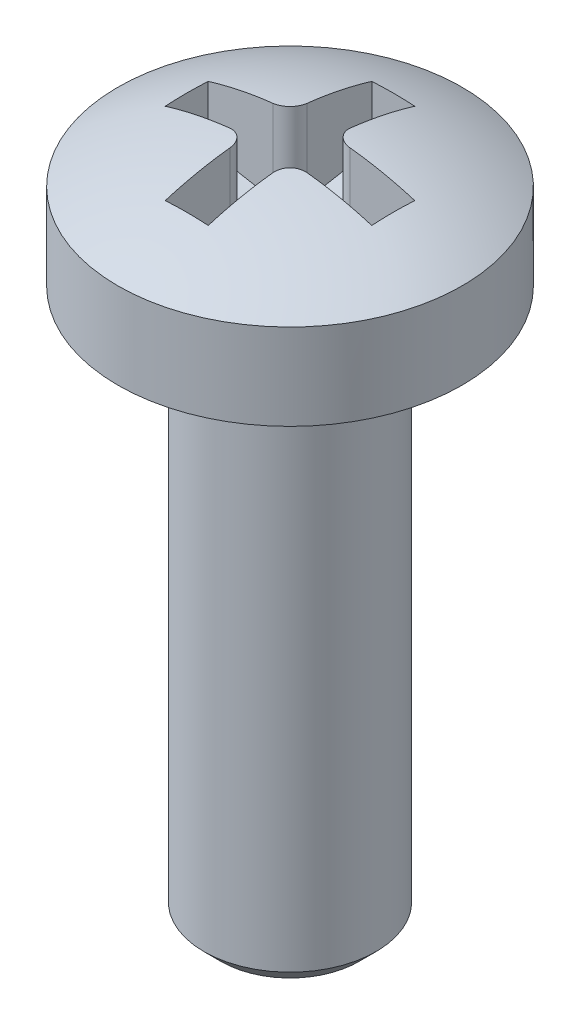
ISO-10303-21;
HEADER;
FILE_DESCRIPTION(('STEP AP214'),'2;1');
FILE_NAME('part.step','',(''),(''),'','','');
FILE_SCHEMA(('AUTOMOTIVE_DESIGN { 1 0 10303 214 1 1 1 1 }'));
ENDSEC;
DATA;
#1=APPLICATION_CONTEXT('core data for automotive mechanical design processes');
#2=APPLICATION_PROTOCOL_DEFINITION('international standard','automotive_design',2000,#1);
#3=PRODUCT_CONTEXT('',#1,'mechanical');
#4=PRODUCT('Part','Part','',(#3));
#5=PRODUCT_RELATED_PRODUCT_CATEGORY('part','',(#4));
#6=PRODUCT_DEFINITION_FORMATION('','',#4);
#7=PRODUCT_DEFINITION_CONTEXT('part definition',#1,'design');
#8=PRODUCT_DEFINITION('design','',#6,#7);
#9=PRODUCT_DEFINITION_SHAPE('','',#8);
#10=(LENGTH_UNIT() NAMED_UNIT(*) SI_UNIT(.MILLI.,.METRE.));
#11=(NAMED_UNIT(*) PLANE_ANGLE_UNIT() SI_UNIT($,.RADIAN.));
#12=(NAMED_UNIT(*) SI_UNIT($,.STERADIAN.) SOLID_ANGLE_UNIT());
#13=UNCERTAINTY_MEASURE_WITH_UNIT(LENGTH_MEASURE(1.E-05),#10,'distance_accuracy_value','');
#14=(GEOMETRIC_REPRESENTATION_CONTEXT(3) GLOBAL_UNCERTAINTY_ASSIGNED_CONTEXT((#13)) GLOBAL_UNIT_ASSIGNED_CONTEXT((#10,
#11,#12)) REPRESENTATION_CONTEXT('',''));
#15=CARTESIAN_POINT('',(0.,0.,0.));
#16=DIRECTION('',(0.,0.,1.));
#17=DIRECTION('',(1.,0.,0.));
#18=AXIS2_PLACEMENT_3D('',#15,#16,#17);
#19=CARTESIAN_POINT('',(2.5,-16.,0.));
#20=DIRECTION('',(0.,1.,0.));
#21=DIRECTION('',(0.,0.,1.));
#22=AXIS2_PLACEMENT_3D('',#19,#20,#21);
#23=PLANE('',#22);
#24=CARTESIAN_POINT('',(0.,-16.,0.));
#25=DIRECTION('',(0.,1.,0.));
#26=DIRECTION('',(0.,0.,1.));
#27=AXIS2_PLACEMENT_3D('',#24,#25,#26);
#28=CIRCLE('',#27,2.);
#29=CARTESIAN_POINT('',(0.,-16.,2.));
#30=VERTEX_POINT('',#29);
#31=EDGE_CURVE('E11',#30,#30,#28,.F.);
#32=ORIENTED_EDGE('',*,*,#31,.T.);
#33=EDGE_LOOP('',(#32));
#34=FACE_BOUND('',#33,.T.);
#35=ADVANCED_FACE('F36',(#34),#23,.F.);
#36=CARTESIAN_POINT('',(0.,-6.46538461538462,0.));
#37=DIRECTION('',(0.,1.,0.));
#38=DIRECTION('',(1.,0.,0.));
#39=AXIS2_PLACEMENT_3D('',#36,#37,#38);
#40=SPHERICAL_SURFACE('',#39,10.2653846153846);
#41=CARTESIAN_POINT('',(0.625,-6.46538461538462,0.));
#42=DIRECTION('',(1.,0.,0.));
#43=DIRECTION('',(0.,0.,-1.));
#44=AXIS2_PLACEMENT_3D('',#41,#42,#43);
#45=CIRCLE('',#44,10.2463406297944);
#46=CARTESIAN_POINT('',(0.625,3.33193625829178,-3.));
#47=VERTEX_POINT('',#46);
#48=CARTESIAN_POINT('',(0.625,3.71900890125521,-1.125));
#49=VERTEX_POINT('',#48);
#50=EDGE_CURVE('E194',#47,#49,#45,.T.);
#51=ORIENTED_EDGE('',*,*,#50,.T.);
#52=CARTESIAN_POINT('',(0.625,3.71900890125521,-1.125));
#53=CARTESIAN_POINT('',(0.624975602651207,3.7220914228297,-1.09711880477183));
#54=CARTESIAN_POINT('',(0.627330849924787,3.72491266406539,-1.06921089519694));
#55=CARTESIAN_POINT('',(0.636653875840498,3.729962597987,-1.01413411665869));
#56=CARTESIAN_POINT('',(0.643619566954553,3.73219155820753,-0.986964919013047));
#57=CARTESIAN_POINT('',(0.662023817094204,3.73599127121508,-0.934111708737336));
#58=CARTESIAN_POINT('',(0.673465704935061,3.7375615323419,-0.908428817784667));
#59=CARTESIAN_POINT('',(0.700500083071321,3.73999497675757,-0.85932222184242));
#60=CARTESIAN_POINT('',(0.716091313212737,3.74085837439667,-0.835897833883606));
#61=CARTESIAN_POINT('',(0.750872145030059,3.74184932599681,-0.792126438535913));
#62=CARTESIAN_POINT('',(0.770037541502189,3.74198165639787,-0.771760303338661));
#63=CARTESIAN_POINT('',(0.811489979951917,3.74151930103214,-0.734502817516431));
#64=CARTESIAN_POINT('',(0.833777509627314,3.7409245015705,-0.717612010780288));
#65=CARTESIAN_POINT('',(0.88076152840619,3.73902843649502,-0.687828007584938));
#66=CARTESIAN_POINT('',(0.90545106020103,3.7377291641501,-0.674923692505519));
#67=CARTESIAN_POINT('',(0.956587201829065,3.73446346613476,-0.65340082748248));
#68=CARTESIAN_POINT('',(0.983033107702002,3.73249730647257,-0.644780572086304));
#69=CARTESIAN_POINT('',(1.02883852967438,3.72863805665691,-0.633950615876966));
#70=CARTESIAN_POINT('',(1.04794862699324,3.72689939522891,-0.63059425172175));
#71=CARTESIAN_POINT('',(1.08637489969124,3.723151293893,-0.626118804740653));
#72=CARTESIAN_POINT('',(1.10569074098977,3.72114224508233,-0.624996526811184));
#73=CARTESIAN_POINT('',(1.125,3.71900890125521,-0.625));
#74=B_SPLINE_CURVE_WITH_KNOTS('',3,(#52,#53,#54,#55,#56,#57,#58,#59,#60,#61,#62,#63,#64,#65,#66,
#67,#68,#69,#70,#71,#72,#73),.UNSPECIFIED.,.F.,.F.,(4,2,2,2,2,2,2,2,2,2,4),(0.,
0.0840504065627116,0.168062782586273,0.25213775526261,0.336187223475732,0.419686897818005,
0.503199629934699,0.58647729096213,0.669721773157889,0.728038449589619,0.786271663678298),.UNSPECIFIED.);
#75=CARTESIAN_POINT('',(1.125,3.71900890125521,-0.625));
#76=VERTEX_POINT('',#75);
#77=EDGE_CURVE('E256',#49,#76,#74,.T.);
#78=ORIENTED_EDGE('',*,*,#77,.T.);
#79=CARTESIAN_POINT('',(0.,-6.46538461538462,-0.625));
#80=DIRECTION('',(0.,0.,-1.));
#81=DIRECTION('',(-1.,0.,0.));
#82=AXIS2_PLACEMENT_3D('',#79,#80,#81);
#83=CIRCLE('',#82,10.2463406297944);
#84=CARTESIAN_POINT('',(3.,3.33193625829178,-0.625));
#85=VERTEX_POINT('',#84);
#86=EDGE_CURVE('E192',#76,#85,#83,.T.);
#87=ORIENTED_EDGE('',*,*,#86,.T.);
#88=CARTESIAN_POINT('',(3.,-6.46538461538462,0.));
#89=DIRECTION('',(1.,0.,0.));
#90=DIRECTION('',(0.,0.,-1.));
#91=AXIS2_PLACEMENT_3D('',#88,#89,#90);
#92=CIRCLE('',#91,9.81723592982135);
#93=CARTESIAN_POINT('',(3.,3.33193625829178,0.625));
#94=VERTEX_POINT('',#93);
#95=EDGE_CURVE('E169',#85,#94,#92,.T.);
#96=ORIENTED_EDGE('',*,*,#95,.T.);
#97=CARTESIAN_POINT('',(0.,-6.46538461538462,0.625));
#98=DIRECTION('',(0.,0.,1.));
#99=DIRECTION('',(1.,0.,0.));
#100=AXIS2_PLACEMENT_3D('',#97,#98,#99);
#101=CIRCLE('',#100,10.2463406297944);
#102=CARTESIAN_POINT('',(1.125,3.71900890125521,0.625));
#103=VERTEX_POINT('',#102);
#104=EDGE_CURVE('E218',#94,#103,#101,.T.);
#105=ORIENTED_EDGE('',*,*,#104,.T.);
#106=CARTESIAN_POINT('',(1.125,3.71900890125521,0.625));
#107=CARTESIAN_POINT('',(1.09711880477183,3.7220914228297,0.624975602651206));
#108=CARTESIAN_POINT('',(1.06921089519694,3.72491266406539,0.627330849924787));
#109=CARTESIAN_POINT('',(1.01413411665869,3.729962597987,0.636653875840497));
#110=CARTESIAN_POINT('',(0.986964919013048,3.73219155820753,0.643619566954553));
#111=CARTESIAN_POINT('',(0.934111708737337,3.73599127121508,0.662023817094204));
#112=CARTESIAN_POINT('',(0.908428817784667,3.7375615323419,0.673465704935061));
#113=CARTESIAN_POINT('',(0.859322221842421,3.73999497675757,0.700500083071321));
#114=CARTESIAN_POINT('',(0.835897833883607,3.74085837439667,0.716091313212737));
#115=CARTESIAN_POINT('',(0.792126438535914,3.74184932599681,0.750872145030058));
#116=CARTESIAN_POINT('',(0.771760303338662,3.74198165639787,0.770037541502188));
#117=CARTESIAN_POINT('',(0.734502817516432,3.74151930103214,0.811489979951917));
#118=CARTESIAN_POINT('',(0.717612010780288,3.7409245015705,0.833777509627314));
#119=CARTESIAN_POINT('',(0.687828007584939,3.73902843649502,0.88076152840619));
#120=CARTESIAN_POINT('',(0.67492369250552,3.7377291641501,0.90545106020103));
#121=CARTESIAN_POINT('',(0.65340082748248,3.73446346613476,0.956587201829065));
#122=CARTESIAN_POINT('',(0.644780572086305,3.73249730647257,0.983033107702002));
#123=CARTESIAN_POINT('',(0.633950615876966,3.72863805665691,1.02883852967438));
#124=CARTESIAN_POINT('',(0.630594251721751,3.72689939522891,1.04794862699324));
#125=CARTESIAN_POINT('',(0.626118804740654,3.723151293893,1.08637489969124));
#126=CARTESIAN_POINT('',(0.624996526811185,3.72114224508233,1.10569074098977));
#127=CARTESIAN_POINT('',(0.625000000000001,3.71900890125521,1.125));
#128=B_SPLINE_CURVE_WITH_KNOTS('',3,(#106,#107,#108,#109,#110,#111,#112,#113,#114,#115,#116,
#117,#118,#119,#120,#121,#122,#123,#124,#125,#126,#127),.UNSPECIFIED.,.F.,.F.,(4,2,2,2,2,2,2,2,
2,2,4),(0.,0.0840504065627118,0.168062782586273,0.252137755262609,0.336187223475732,
0.419686897818005,0.503199629934699,0.586477290962129,0.669721773157888,0.728038449589619,
0.786271663678298),.UNSPECIFIED.);
#129=CARTESIAN_POINT('',(0.625,3.71900890125521,1.125));
#130=VERTEX_POINT('',#129);
#131=EDGE_CURVE('E251',#103,#130,#128,.T.);
#132=ORIENTED_EDGE('',*,*,#131,.T.);
#133=CARTESIAN_POINT('',(0.625,-6.46538461538462,0.));
#134=DIRECTION('',(1.,0.,0.));
#135=DIRECTION('',(0.,0.,-1.));
#136=AXIS2_PLACEMENT_3D('',#133,#134,#135);
#137=CIRCLE('',#136,10.2463406297944);
#138=CARTESIAN_POINT('',(0.625000000000001,3.33193625829178,3.));
#139=VERTEX_POINT('',#138);
#140=EDGE_CURVE('E216',#130,#139,#137,.T.);
#141=ORIENTED_EDGE('',*,*,#140,.T.);
#142=CARTESIAN_POINT('',(0.,-6.46538461538462,3.));
#143=DIRECTION('',(0.,0.,1.));
#144=DIRECTION('',(1.,0.,0.));
#145=AXIS2_PLACEMENT_3D('',#142,#143,#144);
#146=CIRCLE('',#145,9.81723592982135);
#147=CARTESIAN_POINT('',(-0.624999999999999,3.33193625829178,3.));
#148=VERTEX_POINT('',#147);
#149=EDGE_CURVE('E213',#139,#148,#146,.T.);
#150=ORIENTED_EDGE('',*,*,#149,.T.);
#151=CARTESIAN_POINT('',(-0.624999999999999,-6.46538461538462,0.));
#152=DIRECTION('',(-1.,0.,0.));
#153=DIRECTION('',(0.,0.,1.));
#154=AXIS2_PLACEMENT_3D('',#151,#152,#153);
#155=CIRCLE('',#154,10.2463406297944);
#156=CARTESIAN_POINT('',(-0.624999999999999,3.71900890125521,1.125));
#157=VERTEX_POINT('',#156);
#158=EDGE_CURVE('E210',#148,#157,#155,.T.);
#159=ORIENTED_EDGE('',*,*,#158,.T.);
#160=CARTESIAN_POINT('',(-0.624999999999999,3.71900890125521,1.125));
#161=CARTESIAN_POINT('',(-0.624975602651206,3.7220914228297,1.09711880477183));
#162=CARTESIAN_POINT('',(-0.627330849924786,3.72491266406539,1.06921089519694));
#163=CARTESIAN_POINT('',(-0.636653875840497,3.729962597987,1.01413411665869));
#164=CARTESIAN_POINT('',(-0.643619566954552,3.73219155820753,0.986964919013047));
#165=CARTESIAN_POINT('',(-0.662023817094204,3.73599127121508,0.934111708737336));
#166=CARTESIAN_POINT('',(-0.67346570493506,3.7375615323419,0.908428817784667));
#167=CARTESIAN_POINT('',(-0.70050008307132,3.73999497675757,0.85932222184242));
#168=CARTESIAN_POINT('',(-0.716091313212736,3.74085837439667,0.835897833883606));
#169=CARTESIAN_POINT('',(-0.750872145030058,3.74184932599681,0.792126438535913));
#170=CARTESIAN_POINT('',(-0.770037541502188,3.74198165639787,0.771760303338661));
#171=CARTESIAN_POINT('',(-0.811489979951917,3.74151930103214,0.734502817516431));
#172=CARTESIAN_POINT('',(-0.833777509627313,3.7409245015705,0.717612010780288));
#173=CARTESIAN_POINT('',(-0.880761528406189,3.73902843649502,0.687828007584939));
#174=CARTESIAN_POINT('',(-0.905451060201029,3.7377291641501,0.674923692505519));
#175=CARTESIAN_POINT('',(-0.956587201829064,3.73446346613476,0.65340082748248));
#176=CARTESIAN_POINT('',(-0.983033107702001,3.73249730647257,0.644780572086305));
#177=CARTESIAN_POINT('',(-1.02883852967438,3.72863805665691,0.633950615876966));
#178=CARTESIAN_POINT('',(-1.04794862699324,3.72689939522891,0.630594251721751));
#179=CARTESIAN_POINT('',(-1.08637489969123,3.723151293893,0.626118804740654));
#180=CARTESIAN_POINT('',(-1.10569074098977,3.72114224508233,0.624996526811184));
#181=CARTESIAN_POINT('',(-1.125,3.71900890125521,0.625));
#182=B_SPLINE_CURVE_WITH_KNOTS('',3,(#160,#161,#162,#163,#164,#165,#166,#167,#168,#169,#170,
#171,#172,#173,#174,#175,#176,#177,#178,#179,#180,#181),.UNSPECIFIED.,.F.,.F.,(4,2,2,2,2,2,2,2,
2,2,4),(0.,0.0840504065627118,0.168062782586273,0.25213775526261,0.336187223475732,
0.419686897818005,0.503199629934699,0.586477290962129,0.669721773157888,0.728038449589619,
0.786271663678298),.UNSPECIFIED.);
#183=CARTESIAN_POINT('',(-1.125,3.71900890125521,0.625));
#184=VERTEX_POINT('',#183);
#185=EDGE_CURVE('E230',#157,#184,#182,.T.);
#186=ORIENTED_EDGE('',*,*,#185,.T.);
#187=CARTESIAN_POINT('',(0.,-6.46538461538462,0.625));
#188=DIRECTION('',(0.,0.,1.));
#189=DIRECTION('',(1.,0.,0.));
#190=AXIS2_PLACEMENT_3D('',#187,#188,#189);
#191=CIRCLE('',#190,10.2463406297944);
#192=CARTESIAN_POINT('',(-3.,3.33193625829178,0.625));
#193=VERTEX_POINT('',#192);
#194=EDGE_CURVE('E208',#184,#193,#191,.T.);
#195=ORIENTED_EDGE('',*,*,#194,.T.);
#196=CARTESIAN_POINT('',(-3.,-6.46538461538462,0.));
#197=DIRECTION('',(-1.,0.,0.));
#198=DIRECTION('',(0.,0.,1.));
#199=AXIS2_PLACEMENT_3D('',#196,#197,#198);
#200=CIRCLE('',#199,9.81723592982135);
#201=CARTESIAN_POINT('',(-3.,3.33193625829178,-0.625));
#202=VERTEX_POINT('',#201);
#203=EDGE_CURVE('E205',#193,#202,#200,.T.);
#204=ORIENTED_EDGE('',*,*,#203,.T.);
#205=CARTESIAN_POINT('',(0.,-6.46538461538462,-0.625));
#206=DIRECTION('',(0.,0.,-1.));
#207=DIRECTION('',(-1.,0.,0.));
#208=AXIS2_PLACEMENT_3D('',#205,#206,#207);
#209=CIRCLE('',#208,10.2463406297944);
#210=CARTESIAN_POINT('',(-1.125,3.71900890125521,-0.625));
#211=VERTEX_POINT('',#210);
#212=EDGE_CURVE('E202',#202,#211,#209,.T.);
#213=ORIENTED_EDGE('',*,*,#212,.T.);
#214=CARTESIAN_POINT('',(-1.125,3.71900890125521,-0.625));
#215=CARTESIAN_POINT('',(-1.09711880477183,3.7220914228297,-0.624975602651206));
#216=CARTESIAN_POINT('',(-1.06921089519694,3.72491266406539,-0.627330849924786));
#217=CARTESIAN_POINT('',(-1.01413411665869,3.729962597987,-0.636653875840497));
#218=CARTESIAN_POINT('',(-0.986964919013047,3.73219155820753,-0.643619566954553));
#219=CARTESIAN_POINT('',(-0.934111708737336,3.73599127121508,-0.662023817094204));
#220=CARTESIAN_POINT('',(-0.908428817784667,3.7375615323419,-0.673465704935061));
#221=CARTESIAN_POINT('',(-0.85932222184242,3.73999497675757,-0.700500083071321));
#222=CARTESIAN_POINT('',(-0.835897833883606,3.74085837439667,-0.716091313212736));
#223=CARTESIAN_POINT('',(-0.792126438535913,3.74184932599681,-0.750872145030058));
#224=CARTESIAN_POINT('',(-0.771760303338661,3.74198165639787,-0.770037541502188));
#225=CARTESIAN_POINT('',(-0.734502817516431,3.74151930103214,-0.811489979951917));
#226=CARTESIAN_POINT('',(-0.717612010780288,3.7409245015705,-0.833777509627314));
#227=CARTESIAN_POINT('',(-0.687828007584938,3.73902843649502,-0.88076152840619));
#228=CARTESIAN_POINT('',(-0.674923692505519,3.7377291641501,-0.90545106020103));
#229=CARTESIAN_POINT('',(-0.65340082748248,3.73446346613476,-0.956587201829064));
#230=CARTESIAN_POINT('',(-0.644780572086304,3.73249730647257,-0.983033107702002));
#231=CARTESIAN_POINT('',(-0.633950615876966,3.72863805665691,-1.02883852967438));
#232=CARTESIAN_POINT('',(-0.63059425172175,3.72689939522891,-1.04794862699324));
#233=CARTESIAN_POINT('',(-0.626118804740653,3.723151293893,-1.08637489969123));
#234=CARTESIAN_POINT('',(-0.624996526811184,3.72114224508233,-1.10569074098977));
#235=CARTESIAN_POINT('',(-0.625,3.71900890125521,-1.125));
#236=B_SPLINE_CURVE_WITH_KNOTS('',3,(#214,#215,#216,#217,#218,#219,#220,#221,#222,#223,#224,
#225,#226,#227,#228,#229,#230,#231,#232,#233,#234,#235),.UNSPECIFIED.,.F.,.F.,(4,2,2,2,2,2,2,2,
2,2,4),(0.,0.0840504065627116,0.168062782586273,0.25213775526261,0.336187223475732,
0.419686897818005,0.503199629934699,0.586477290962129,0.669721773157889,0.728038449589619,
0.786271663678298),.UNSPECIFIED.);
#237=CARTESIAN_POINT('',(-0.625,3.71900890125521,-1.125));
#238=VERTEX_POINT('',#237);
#239=EDGE_CURVE('E224',#211,#238,#236,.T.);
#240=ORIENTED_EDGE('',*,*,#239,.T.);
#241=CARTESIAN_POINT('',(-0.625,-6.46538461538462,0.));
#242=DIRECTION('',(-1.,0.,0.));
#243=DIRECTION('',(0.,0.,1.));
#244=AXIS2_PLACEMENT_3D('',#241,#242,#243);
#245=CIRCLE('',#244,10.2463406297944);
#246=CARTESIAN_POINT('',(-0.625,3.33193625829178,-3.));
#247=VERTEX_POINT('',#246);
#248=EDGE_CURVE('E200',#238,#247,#245,.T.);
#249=ORIENTED_EDGE('',*,*,#248,.T.);
#250=CARTESIAN_POINT('',(0.,-6.46538461538462,-3.));
#251=DIRECTION('',(0.,0.,-1.));
#252=DIRECTION('',(-1.,0.,0.));
#253=AXIS2_PLACEMENT_3D('',#250,#251,#252);
#254=CIRCLE('',#253,9.81723592982135);
#255=EDGE_CURVE('E197',#247,#47,#254,.T.);
#256=ORIENTED_EDGE('',*,*,#255,.T.);
#257=EDGE_LOOP('',(#51,#78,#87,#96,#105,#132,#141,#150,#159,#186,#195,#204,#213,#240,#249,#256));
#258=FACE_BOUND('',#257,.T.);
#259=CARTESIAN_POINT('',(0.,2.5,0.));
#260=DIRECTION('',(0.,1.,0.));
#261=DIRECTION('',(0.,0.,1.));
#262=AXIS2_PLACEMENT_3D('',#259,#260,#261);
#263=CIRCLE('',#262,5.00000000000001);
#264=CARTESIAN_POINT('',(0.,2.5,5.00000000000001));
#265=VERTEX_POINT('',#264);
#266=EDGE_CURVE('E188',#265,#265,#263,.T.);
#267=ORIENTED_EDGE('',*,*,#266,.T.);
#268=EDGE_LOOP('',(#267));
#269=FACE_BOUND('',#268,.T.);
#270=ADVANCED_FACE('F238',(#258,#269),#40,.T.);
#271=CARTESIAN_POINT('',(0.,3.8,0.));
#272=DIRECTION('',(0.,1.,0.));
#273=DIRECTION('',(0.,0.,1.));
#274=AXIS2_PLACEMENT_3D('',#271,#272,#273);
#275=CYLINDRICAL_SURFACE('',#274,5.);
#276=ORIENTED_EDGE('',*,*,#266,.F.);
#277=EDGE_LOOP('',(#276));
#278=FACE_BOUND('',#277,.T.);
#279=CARTESIAN_POINT('',(0.,0.,0.));
#280=DIRECTION('',(0.,1.,0.));
#281=DIRECTION('',(0.,0.,1.));
#282=AXIS2_PLACEMENT_3D('',#279,#280,#281);
#283=CIRCLE('',#282,5.);
#284=CARTESIAN_POINT('',(0.,0.,5.));
#285=VERTEX_POINT('',#284);
#286=EDGE_CURVE('E180',#285,#285,#283,.T.);
#287=ORIENTED_EDGE('',*,*,#286,.T.);
#288=EDGE_LOOP('',(#287));
#289=FACE_BOUND('',#288,.T.);
#290=ADVANCED_FACE('F243',(#278,#289),#275,.T.);
#291=CARTESIAN_POINT('',(5.,0.,0.));
#292=DIRECTION('',(0.,1.,0.));
#293=DIRECTION('',(0.,0.,1.));
#294=AXIS2_PLACEMENT_3D('',#291,#292,#293);
#295=PLANE('',#294);
#296=ORIENTED_EDGE('',*,*,#286,.F.);
#297=EDGE_LOOP('',(#296));
#298=FACE_BOUND('',#297,.T.);
#299=CARTESIAN_POINT('',(0.,0.,0.));
#300=DIRECTION('',(0.,1.,0.));
#301=DIRECTION('',(0.,0.,1.));
#302=AXIS2_PLACEMENT_3D('',#299,#300,#301);
#303=CIRCLE('',#302,2.5);
#304=CARTESIAN_POINT('',(0.,0.,2.5));
#305=VERTEX_POINT('',#304);
#306=EDGE_CURVE('E177',#305,#305,#303,.T.);
#307=ORIENTED_EDGE('',*,*,#306,.T.);
#308=EDGE_LOOP('',(#307));
#309=FACE_BOUND('',#308,.T.);
#310=ADVANCED_FACE('F330',(#298,#309),#295,.F.);
#311=CARTESIAN_POINT('',(0.,3.8,0.));
#312=DIRECTION('',(0.,1.,0.));
#313=DIRECTION('',(0.,0.,1.));
#314=AXIS2_PLACEMENT_3D('',#311,#312,#313);
#315=CYLINDRICAL_SURFACE('',#314,2.5);
#316=CARTESIAN_POINT('',(0.,-15.5,0.));
#317=DIRECTION('',(0.,1.,0.));
#318=DIRECTION('',(0.,0.,1.));
#319=AXIS2_PLACEMENT_3D('',#316,#317,#318);
#320=CIRCLE('',#319,2.5);
#321=CARTESIAN_POINT('',(0.,-15.5,2.5));
#322=VERTEX_POINT('',#321);
#323=EDGE_CURVE('E44',#322,#322,#320,.T.);
#324=ORIENTED_EDGE('',*,*,#323,.T.);
#325=EDGE_LOOP('',(#324));
#326=FACE_BOUND('',#325,.T.);
#327=ORIENTED_EDGE('',*,*,#306,.F.);
#328=EDGE_LOOP('',(#327));
#329=FACE_BOUND('',#328,.T.);
#330=ADVANCED_FACE('F302',(#326,#329),#315,.T.);
#331=CARTESIAN_POINT('',(0.625,-16.001,0.625));
#332=DIRECTION('',(0.,0.,1.));
#333=DIRECTION('',(1.,0.,0.));
#334=AXIS2_PLACEMENT_3D('',#331,#332,#333);
#335=PLANE('',#334);
#336=CARTESIAN_POINT('',(0.,11.875,0.625));
#337=DIRECTION('',(0.,0.,1.));
#338=DIRECTION('',(1.,0.,0.));
#339=AXIS2_PLACEMENT_3D('',#336,#337,#338);
#340=CIRCLE('',#339,10.6066017177982);
#341=CARTESIAN_POINT('',(3.,1.7015050253121,0.625));
#342=VERTEX_POINT('',#341);
#343=CARTESIAN_POINT('',(1.125,1.32822916718107,0.625));
#344=VERTEX_POINT('',#343);
#345=EDGE_CURVE('E175',#342,#344,#340,.F.);
#346=ORIENTED_EDGE('',*,*,#345,.T.);
#347=DIRECTION('',(0.,1.,0.));
#348=VECTOR('',#347,1.);
#349=CARTESIAN_POINT('',(1.125,-16.001,0.625));
#350=LINE('',#349,#348);
#351=EDGE_CURVE('E555',#344,#103,#350,.T.);
#352=ORIENTED_EDGE('',*,*,#351,.T.);
#353=ORIENTED_EDGE('',*,*,#104,.F.);
#354=DIRECTION('',(0.,1.,0.));
#355=VECTOR('',#354,1.);
#356=CARTESIAN_POINT('',(3.,-16.001,0.625));
#357=LINE('',#356,#355);
#358=EDGE_CURVE('E171',#342,#94,#357,.T.);
#359=ORIENTED_EDGE('',*,*,#358,.F.);
#360=EDGE_LOOP('',(#346,#352,#353,#359));
#361=FACE_BOUND('',#360,.T.);
#362=ADVANCED_FACE('F343',(#361),#335,.F.);
#363=CARTESIAN_POINT('',(0.625,-16.001,0.625));
#364=DIRECTION('',(1.,0.,0.));
#365=DIRECTION('',(0.,0.,-1.));
#366=AXIS2_PLACEMENT_3D('',#363,#364,#365);
#367=PLANE('',#366);
#368=ORIENTED_EDGE('',*,*,#140,.F.);
#369=DIRECTION('',(0.,1.,0.));
#370=VECTOR('',#369,1.);
#371=CARTESIAN_POINT('',(0.625,-16.001,1.125));
#372=LINE('',#371,#370);
#373=CARTESIAN_POINT('',(0.625,1.32822916718107,1.125));
#374=VERTEX_POINT('',#373);
#375=EDGE_CURVE('E553',#130,#374,#372,.F.);
#376=ORIENTED_EDGE('',*,*,#375,.T.);
#377=CARTESIAN_POINT('',(0.625,11.875,0.));
#378=DIRECTION('',(1.,0.,0.));
#379=DIRECTION('',(0.,0.,-1.));
#380=AXIS2_PLACEMENT_3D('',#377,#378,#379);
#381=CIRCLE('',#380,10.6066017177982);
#382=CARTESIAN_POINT('',(0.625000000000001,1.7015050253121,3.));
#383=VERTEX_POINT('',#382);
#384=EDGE_CURVE('E182',#374,#383,#381,.F.);
#385=ORIENTED_EDGE('',*,*,#384,.T.);
#386=DIRECTION('',(0.,1.,0.));
#387=VECTOR('',#386,1.);
#388=CARTESIAN_POINT('',(0.625000000000001,-16.001,3.));
#389=LINE('',#388,#387);
#390=EDGE_CURVE('E161',#383,#139,#389,.T.);
#391=ORIENTED_EDGE('',*,*,#390,.T.);
#392=EDGE_LOOP('',(#368,#376,#385,#391));
#393=FACE_BOUND('',#392,.T.);
#394=ADVANCED_FACE('F291',(#393),#367,.F.);
#395=CARTESIAN_POINT('',(-0.624999999999999,-16.001,3.));
#396=DIRECTION('',(0.,0.,1.));
#397=DIRECTION('',(1.,0.,0.));
#398=AXIS2_PLACEMENT_3D('',#395,#396,#397);
#399=PLANE('',#398);
#400=ORIENTED_EDGE('',*,*,#390,.F.);
#401=CARTESIAN_POINT('',(0.,11.875,3.));
#402=DIRECTION('',(0.,0.,1.));
#403=DIRECTION('',(1.,0.,0.));
#404=AXIS2_PLACEMENT_3D('',#401,#402,#403);
#405=CIRCLE('',#404,10.1926750659481);
#406=CARTESIAN_POINT('',(-0.624999999999999,1.7015050253121,3.));
#407=VERTEX_POINT('',#406);
#408=EDGE_CURVE('E517',#383,#407,#405,.F.);
#409=ORIENTED_EDGE('',*,*,#408,.T.);
#410=DIRECTION('',(0.,1.,0.));
#411=VECTOR('',#410,1.);
#412=CARTESIAN_POINT('',(-0.624999999999999,-16.001,3.));
#413=LINE('',#412,#411);
#414=EDGE_CURVE('E516',#407,#148,#413,.T.);
#415=ORIENTED_EDGE('',*,*,#414,.T.);
#416=ORIENTED_EDGE('',*,*,#149,.F.);
#417=EDGE_LOOP('',(#400,#409,#415,#416));
#418=FACE_BOUND('',#417,.T.);
#419=ADVANCED_FACE('F356',(#418),#399,.F.);
#420=CARTESIAN_POINT('',(-0.624999999999999,-16.001,0.625));
#421=DIRECTION('',(-1.,0.,0.));
#422=DIRECTION('',(0.,0.,1.));
#423=AXIS2_PLACEMENT_3D('',#420,#421,#422);
#424=PLANE('',#423);
#425=CARTESIAN_POINT('',(-0.624999999999999,11.875,0.));
#426=DIRECTION('',(-1.,0.,0.));
#427=DIRECTION('',(0.,0.,1.));
#428=AXIS2_PLACEMENT_3D('',#425,#426,#427);
#429=CIRCLE('',#428,10.6066017177982);
#430=CARTESIAN_POINT('',(-0.624999999999999,1.32822916718107,1.125));
#431=VERTEX_POINT('',#430);
#432=EDGE_CURVE('E511',#407,#431,#429,.F.);
#433=ORIENTED_EDGE('',*,*,#432,.T.);
#434=DIRECTION('',(0.,1.,0.));
#435=VECTOR('',#434,1.);
#436=CARTESIAN_POINT('',(-0.624999999999999,-16.001,1.125));
#437=LINE('',#436,#435);
#438=EDGE_CURVE('E506',#431,#157,#437,.T.);
#439=ORIENTED_EDGE('',*,*,#438,.T.);
#440=ORIENTED_EDGE('',*,*,#158,.F.);
#441=ORIENTED_EDGE('',*,*,#414,.F.);
#442=EDGE_LOOP('',(#433,#439,#440,#441));
#443=FACE_BOUND('',#442,.T.);
#444=ADVANCED_FACE('F363',(#443),#424,.F.);
#445=CARTESIAN_POINT('',(-3.,-16.001,0.625));
#446=DIRECTION('',(0.,0.,1.));
#447=DIRECTION('',(1.,0.,0.));
#448=AXIS2_PLACEMENT_3D('',#445,#446,#447);
#449=PLANE('',#448);
#450=ORIENTED_EDGE('',*,*,#194,.F.);
#451=DIRECTION('',(0.,1.,0.));
#452=VECTOR('',#451,1.);
#453=CARTESIAN_POINT('',(-1.125,-16.001,0.625));
#454=LINE('',#453,#452);
#455=CARTESIAN_POINT('',(-1.125,1.32822916718107,0.625));
#456=VERTEX_POINT('',#455);
#457=EDGE_CURVE('E504',#184,#456,#454,.F.);
#458=ORIENTED_EDGE('',*,*,#457,.T.);
#459=CARTESIAN_POINT('',(0.,11.875,0.625));
#460=DIRECTION('',(0.,0.,1.));
#461=DIRECTION('',(1.,0.,0.));
#462=AXIS2_PLACEMENT_3D('',#459,#460,#461);
#463=CIRCLE('',#462,10.6066017177982);
#464=CARTESIAN_POINT('',(-3.,1.7015050253121,0.625));
#465=VERTEX_POINT('',#464);
#466=EDGE_CURVE('E514',#456,#465,#463,.F.);
#467=ORIENTED_EDGE('',*,*,#466,.T.);
#468=DIRECTION('',(0.,1.,0.));
#469=VECTOR('',#468,1.);
#470=CARTESIAN_POINT('',(-3.,-16.001,0.625));
#471=LINE('',#470,#469);
#472=EDGE_CURVE('E528',#465,#193,#471,.T.);
#473=ORIENTED_EDGE('',*,*,#472,.T.);
#474=EDGE_LOOP('',(#450,#458,#467,#473));
#475=FACE_BOUND('',#474,.T.);
#476=ADVANCED_FACE('F370',(#475),#449,.F.);
#477=CARTESIAN_POINT('',(-3.,-16.001,-0.625));
#478=DIRECTION('',(-1.,0.,0.));
#479=DIRECTION('',(0.,0.,1.));
#480=AXIS2_PLACEMENT_3D('',#477,#478,#479);
#481=PLANE('',#480);
#482=ORIENTED_EDGE('',*,*,#472,.F.);
#483=CARTESIAN_POINT('',(-3.,11.875,0.));
#484=DIRECTION('',(-1.,0.,0.));
#485=DIRECTION('',(0.,0.,1.));
#486=AXIS2_PLACEMENT_3D('',#483,#484,#485);
#487=CIRCLE('',#486,10.1926750659481);
#488=CARTESIAN_POINT('',(-3.,1.7015050253121,-0.625));
#489=VERTEX_POINT('',#488);
#490=EDGE_CURVE('E520',#465,#489,#487,.F.);
#491=ORIENTED_EDGE('',*,*,#490,.T.);
#492=DIRECTION('',(0.,1.,0.));
#493=VECTOR('',#492,1.);
#494=CARTESIAN_POINT('',(-3.,-16.001,-0.625));
#495=LINE('',#494,#493);
#496=EDGE_CURVE('E531',#489,#202,#495,.T.);
#497=ORIENTED_EDGE('',*,*,#496,.T.);
#498=ORIENTED_EDGE('',*,*,#203,.F.);
#499=EDGE_LOOP('',(#482,#491,#497,#498));
#500=FACE_BOUND('',#499,.T.);
#501=ADVANCED_FACE('F378',(#500),#481,.F.);
#502=CARTESIAN_POINT('',(-3.,-16.001,-0.625));
#503=DIRECTION('',(0.,0.,-1.));
#504=DIRECTION('',(-1.,0.,0.));
#505=AXIS2_PLACEMENT_3D('',#502,#503,#504);
#506=PLANE('',#505);
#507=CARTESIAN_POINT('',(0.,11.875,-0.625));
#508=DIRECTION('',(0.,0.,-1.));
#509=DIRECTION('',(-1.,0.,0.));
#510=AXIS2_PLACEMENT_3D('',#507,#508,#509);
#511=CIRCLE('',#510,10.6066017177982);
#512=CARTESIAN_POINT('',(-1.125,1.32822916718107,-0.625));
#513=VERTEX_POINT('',#512);
#514=EDGE_CURVE('E563',#489,#513,#511,.F.);
#515=ORIENTED_EDGE('',*,*,#514,.T.);
#516=DIRECTION('',(0.,1.,0.));
#517=VECTOR('',#516,1.);
#518=CARTESIAN_POINT('',(-1.125,-16.001,-0.625));
#519=LINE('',#518,#517);
#520=EDGE_CURVE('E548',#513,#211,#519,.T.);
#521=ORIENTED_EDGE('',*,*,#520,.T.);
#522=ORIENTED_EDGE('',*,*,#212,.F.);
#523=ORIENTED_EDGE('',*,*,#496,.F.);
#524=EDGE_LOOP('',(#515,#521,#522,#523));
#525=FACE_BOUND('',#524,.T.);
#526=ADVANCED_FACE('F386',(#525),#506,.F.);
#527=CARTESIAN_POINT('',(-0.625,-16.001,-3.));
#528=DIRECTION('',(-1.,0.,0.));
#529=DIRECTION('',(0.,0.,1.));
#530=AXIS2_PLACEMENT_3D('',#527,#528,#529);
#531=PLANE('',#530);
#532=ORIENTED_EDGE('',*,*,#248,.F.);
#533=DIRECTION('',(0.,1.,0.));
#534=VECTOR('',#533,1.);
#535=CARTESIAN_POINT('',(-0.625,-16.001,-1.125));
#536=LINE('',#535,#534);
#537=CARTESIAN_POINT('',(-0.625,1.32822916718107,-1.125));
#538=VERTEX_POINT('',#537);
#539=EDGE_CURVE('E51',#238,#538,#536,.F.);
#540=ORIENTED_EDGE('',*,*,#539,.T.);
#541=CARTESIAN_POINT('',(-0.625,11.875,0.));
#542=DIRECTION('',(-1.,0.,0.));
#543=DIRECTION('',(0.,0.,1.));
#544=AXIS2_PLACEMENT_3D('',#541,#542,#543);
#545=CIRCLE('',#544,10.6066017177982);
#546=CARTESIAN_POINT('',(-0.625,1.7015050253121,-3.));
#547=VERTEX_POINT('',#546);
#548=EDGE_CURVE('E559',#538,#547,#545,.F.);
#549=ORIENTED_EDGE('',*,*,#548,.T.);
#550=DIRECTION('',(0.,1.,0.));
#551=VECTOR('',#550,1.);
#552=CARTESIAN_POINT('',(-0.625,-16.001,-3.));
#553=LINE('',#552,#551);
#554=EDGE_CURVE('E534',#547,#247,#553,.T.);
#555=ORIENTED_EDGE('',*,*,#554,.T.);
#556=EDGE_LOOP('',(#532,#540,#549,#555));
#557=FACE_BOUND('',#556,.T.);
#558=ADVANCED_FACE('F394',(#557),#531,.F.);
#559=CARTESIAN_POINT('',(-0.625,-16.001,-3.));
#560=DIRECTION('',(0.,0.,-1.));
#561=DIRECTION('',(-1.,0.,0.));
#562=AXIS2_PLACEMENT_3D('',#559,#560,#561);
#563=PLANE('',#562);
#564=ORIENTED_EDGE('',*,*,#554,.F.);
#565=CARTESIAN_POINT('',(0.,11.875,-3.));
#566=DIRECTION('',(0.,0.,-1.));
#567=DIRECTION('',(-1.,0.,0.));
#568=AXIS2_PLACEMENT_3D('',#565,#566,#567);
#569=CIRCLE('',#568,10.1926750659481);
#570=CARTESIAN_POINT('',(0.625,1.7015050253121,-3.));
#571=VERTEX_POINT('',#570);
#572=EDGE_CURVE('E542',#547,#571,#569,.F.);
#573=ORIENTED_EDGE('',*,*,#572,.T.);
#574=DIRECTION('',(0.,1.,0.));
#575=VECTOR('',#574,1.);
#576=CARTESIAN_POINT('',(0.625,-16.001,-3.));
#577=LINE('',#576,#575);
#578=EDGE_CURVE('E170',#571,#47,#577,.T.);
#579=ORIENTED_EDGE('',*,*,#578,.T.);
#580=ORIENTED_EDGE('',*,*,#255,.F.);
#581=EDGE_LOOP('',(#564,#573,#579,#580));
#582=FACE_BOUND('',#581,.T.);
#583=ADVANCED_FACE('F402',(#582),#563,.F.);
#584=CARTESIAN_POINT('',(0.625,-16.001,-3.));
#585=DIRECTION('',(1.,0.,0.));
#586=DIRECTION('',(0.,0.,-1.));
#587=AXIS2_PLACEMENT_3D('',#584,#585,#586);
#588=PLANE('',#587);
#589=CARTESIAN_POINT('',(0.625,11.875,0.));
#590=DIRECTION('',(1.,0.,0.));
#591=DIRECTION('',(0.,0.,-1.));
#592=AXIS2_PLACEMENT_3D('',#589,#590,#591);
#593=CIRCLE('',#592,10.6066017177982);
#594=CARTESIAN_POINT('',(0.625,1.32822916718107,-1.125));
#595=VERTEX_POINT('',#594);
#596=EDGE_CURVE('E160',#571,#595,#593,.F.);
#597=ORIENTED_EDGE('',*,*,#596,.T.);
#598=DIRECTION('',(0.,1.,0.));
#599=VECTOR('',#598,1.);
#600=CARTESIAN_POINT('',(0.625,-16.001,-1.125));
#601=LINE('',#600,#599);
#602=EDGE_CURVE('E221',#595,#49,#601,.T.);
#603=ORIENTED_EDGE('',*,*,#602,.T.);
#604=ORIENTED_EDGE('',*,*,#50,.F.);
#605=ORIENTED_EDGE('',*,*,#578,.F.);
#606=EDGE_LOOP('',(#597,#603,#604,#605));
#607=FACE_BOUND('',#606,.T.);
#608=ADVANCED_FACE('F409',(#607),#588,.F.);
#609=CARTESIAN_POINT('',(0.625,-16.001,-0.625));
#610=DIRECTION('',(0.,0.,-1.));
#611=DIRECTION('',(-1.,0.,0.));
#612=AXIS2_PLACEMENT_3D('',#609,#610,#611);
#613=PLANE('',#612);
#614=ORIENTED_EDGE('',*,*,#86,.F.);
#615=DIRECTION('',(0.,1.,0.));
#616=VECTOR('',#615,1.);
#617=CARTESIAN_POINT('',(1.125,-16.001,-0.625));
#618=LINE('',#617,#616);
#619=CARTESIAN_POINT('',(1.125,1.32822916718107,-0.625));
#620=VERTEX_POINT('',#619);
#621=EDGE_CURVE('E157',#76,#620,#618,.F.);
#622=ORIENTED_EDGE('',*,*,#621,.T.);
#623=CARTESIAN_POINT('',(0.,11.875,-0.625));
#624=DIRECTION('',(0.,0.,-1.));
#625=DIRECTION('',(-1.,0.,0.));
#626=AXIS2_PLACEMENT_3D('',#623,#624,#625);
#627=CIRCLE('',#626,10.6066017177982);
#628=CARTESIAN_POINT('',(3.,1.7015050253121,-0.625));
#629=VERTEX_POINT('',#628);
#630=EDGE_CURVE('E151',#620,#629,#627,.F.);
#631=ORIENTED_EDGE('',*,*,#630,.T.);
#632=DIRECTION('',(0.,1.,0.));
#633=VECTOR('',#632,1.);
#634=CARTESIAN_POINT('',(3.,-16.001,-0.625));
#635=LINE('',#634,#633);
#636=EDGE_CURVE('E155',#629,#85,#635,.T.);
#637=ORIENTED_EDGE('',*,*,#636,.T.);
#638=EDGE_LOOP('',(#614,#622,#631,#637));
#639=FACE_BOUND('',#638,.T.);
#640=ADVANCED_FACE('F154',(#639),#613,.F.);
#641=CARTESIAN_POINT('',(3.,-16.001,-0.625));
#642=DIRECTION('',(1.,0.,0.));
#643=DIRECTION('',(0.,0.,-1.));
#644=AXIS2_PLACEMENT_3D('',#641,#642,#643);
#645=PLANE('',#644);
#646=ORIENTED_EDGE('',*,*,#636,.F.);
#647=CARTESIAN_POINT('',(3.,11.875,0.));
#648=DIRECTION('',(1.,0.,0.));
#649=DIRECTION('',(0.,0.,-1.));
#650=AXIS2_PLACEMENT_3D('',#647,#648,#649);
#651=CIRCLE('',#650,10.1926750659481);
#652=EDGE_CURVE('E166',#629,#342,#651,.F.);
#653=ORIENTED_EDGE('',*,*,#652,.T.);
#654=ORIENTED_EDGE('',*,*,#358,.T.);
#655=ORIENTED_EDGE('',*,*,#95,.F.);
#656=EDGE_LOOP('',(#646,#653,#654,#655));
#657=FACE_BOUND('',#656,.T.);
#658=ADVANCED_FACE('F165',(#657),#645,.F.);
#659=CARTESIAN_POINT('',(0.,11.875,0.));
#660=DIRECTION('',(0.,1.,0.));
#661=DIRECTION('',(1.,0.,0.));
#662=AXIS2_PLACEMENT_3D('',#659,#660,#661);
#663=SPHERICAL_SURFACE('',#662,10.625);
#664=ORIENTED_EDGE('',*,*,#345,.F.);
#665=ORIENTED_EDGE('',*,*,#652,.F.);
#666=ORIENTED_EDGE('',*,*,#630,.F.);
#667=CARTESIAN_POINT('',(1.125,1.32822916718107,-0.625));
#668=CARTESIAN_POINT('',(1.09710236897073,1.32525080728983,-0.624975632972495));
#669=CARTESIAN_POINT('',(1.0691802571592,1.32252518608149,-0.627333587382392));
#670=CARTESIAN_POINT('',(1.01408024546152,1.31764695626586,-0.636665425591429));
#671=CARTESIAN_POINT('',(0.986901998528026,1.31549407621448,-0.643637117279218));
#672=CARTESIAN_POINT('',(0.934035695319584,1.31182457559855,-0.662054669529735));
#673=CARTESIAN_POINT('',(0.908348737542372,1.31030841905211,-0.673503781359852));
#674=CARTESIAN_POINT('',(0.859237315673922,1.30795932968319,-0.700552850437024));
#675=CARTESIAN_POINT('',(0.835812186852808,1.30712619558446,-0.716151583058476));
#676=CARTESIAN_POINT('',(0.792032162054311,1.30617061814554,-0.750954827037941));
#677=CARTESIAN_POINT('',(0.771659384908674,1.30604386445433,-0.770136729452388));
#678=CARTESIAN_POINT('',(0.7343932971387,1.30649329927766,-0.811624998608194));
#679=CARTESIAN_POINT('',(0.717500540105827,1.3070695995312,-0.833931861512425));
#680=CARTESIAN_POINT('',(0.687714567215951,1.30890548189499,-0.880962084754408));
#681=CARTESIAN_POINT('',(0.674811028275947,1.31016327682683,-0.905678986494527));
#682=CARTESIAN_POINT('',(0.653297475158032,1.31332427017891,-0.956872863201211));
#683=CARTESIAN_POINT('',(0.644685699511478,1.31522720327533,-0.983349111014162));
#684=CARTESIAN_POINT('',(0.633896197765247,1.31895574954156,-1.02912918770528));
#685=CARTESIAN_POINT('',(0.630560373317323,1.32063077100633,-1.0481811605799));
#686=CARTESIAN_POINT('',(0.626112166114797,1.32424071155955,-1.08649080804356));
#687=CARTESIAN_POINT('',(0.62499660943407,1.32617525542259,-1.10574814937569));
#688=CARTESIAN_POINT('',(0.625,1.32822916718107,-1.125));
#689=B_SPLINE_CURVE_WITH_KNOTS('',3,(#667,#668,#669,#670,#671,#672,#673,#674,#675,#676,#677,
#678,#679,#680,#681,#682,#683,#684,#685,#686,#687,#688),.UNSPECIFIED.,.F.,.F.,(4,2,2,2,2,2,2,2,
2,2,4),(0.,0.0840650572615432,0.16809020158957,0.252176474197761,0.336237958954168,
0.419785932063575,0.503347185495759,0.586690357821508,0.669999295375189,0.728118862822623,
0.786155287105349),.UNSPECIFIED.);
#690=EDGE_CURVE('E279',#620,#595,#689,.T.);
#691=ORIENTED_EDGE('',*,*,#690,.T.);
#692=ORIENTED_EDGE('',*,*,#596,.F.);
#693=ORIENTED_EDGE('',*,*,#572,.F.);
#694=ORIENTED_EDGE('',*,*,#548,.F.);
#695=CARTESIAN_POINT('',(-0.625,1.32822916718107,-1.125));
#696=CARTESIAN_POINT('',(-0.624975632972495,1.32525080728983,-1.09710236897073));
#697=CARTESIAN_POINT('',(-0.627333587382392,1.32252518608149,-1.0691802571592));
#698=CARTESIAN_POINT('',(-0.636665425591429,1.31764695626586,-1.01408024546152));
#699=CARTESIAN_POINT('',(-0.643637117279218,1.31549407621448,-0.986901998528026));
#700=CARTESIAN_POINT('',(-0.662054669529735,1.31182457559855,-0.934035695319584));
#701=CARTESIAN_POINT('',(-0.673503781359852,1.31030841905211,-0.908348737542371));
#702=CARTESIAN_POINT('',(-0.700552850437024,1.30795932968319,-0.859237315673922));
#703=CARTESIAN_POINT('',(-0.716151583058476,1.30712619558446,-0.835812186852807));
#704=CARTESIAN_POINT('',(-0.750954827037941,1.30617061814554,-0.792032162054311));
#705=CARTESIAN_POINT('',(-0.770136729452389,1.30604386445433,-0.771659384908674));
#706=CARTESIAN_POINT('',(-0.811624998608194,1.30649329927766,-0.734393297138699));
#707=CARTESIAN_POINT('',(-0.833931861512426,1.3070695995312,-0.717500540105827));
#708=CARTESIAN_POINT('',(-0.880962084754408,1.30890548189499,-0.687714567215951));
#709=CARTESIAN_POINT('',(-0.905678986494527,1.31016327682683,-0.674811028275947));
#710=CARTESIAN_POINT('',(-0.956872863201211,1.31332427017891,-0.653297475158031));
#711=CARTESIAN_POINT('',(-0.983349111014162,1.31522720327533,-0.644685699511478));
#712=CARTESIAN_POINT('',(-1.02912918770528,1.31895574954156,-0.633896197765246));
#713=CARTESIAN_POINT('',(-1.0481811605799,1.32063077100633,-0.630560373317323));
#714=CARTESIAN_POINT('',(-1.08649080804356,1.32424071155955,-0.626112166114796));
#715=CARTESIAN_POINT('',(-1.10574814937569,1.32617525542259,-0.624996609434069));
#716=CARTESIAN_POINT('',(-1.125,1.32822916718107,-0.625));
#717=B_SPLINE_CURVE_WITH_KNOTS('',3,(#695,#696,#697,#698,#699,#700,#701,#702,#703,#704,#705,
#706,#707,#708,#709,#710,#711,#712,#713,#714,#715,#716),.UNSPECIFIED.,.F.,.F.,(4,2,2,2,2,2,2,2,
2,2,4),(0.,0.0840650572615429,0.16809020158957,0.252176474197761,0.336237958954168,
0.419785932063575,0.503347185495759,0.586690357821508,0.669999295375189,0.728118862822623,
0.786155287105349),.UNSPECIFIED.);
#718=EDGE_CURVE('E58',#538,#513,#717,.T.);
#719=ORIENTED_EDGE('',*,*,#718,.T.);
#720=ORIENTED_EDGE('',*,*,#514,.F.);
#721=ORIENTED_EDGE('',*,*,#490,.F.);
#722=ORIENTED_EDGE('',*,*,#466,.F.);
#723=CARTESIAN_POINT('',(-1.125,1.32822916718107,0.625));
#724=CARTESIAN_POINT('',(-1.09710236897073,1.32525080728983,0.624975632972496));
#725=CARTESIAN_POINT('',(-1.0691802571592,1.32252518608149,0.627333587382392));
#726=CARTESIAN_POINT('',(-1.01408024546152,1.31764695626586,0.63666542559143));
#727=CARTESIAN_POINT('',(-0.986901998528025,1.31549407621448,0.643637117279219));
#728=CARTESIAN_POINT('',(-0.934035695319583,1.31182457559855,0.662054669529735));
#729=CARTESIAN_POINT('',(-0.908348737542371,1.31030841905211,0.673503781359852));
#730=CARTESIAN_POINT('',(-0.859237315673921,1.30795932968319,0.700552850437024));
#731=CARTESIAN_POINT('',(-0.835812186852807,1.30712619558446,0.716151583058476));
#732=CARTESIAN_POINT('',(-0.792032162054311,1.30617061814554,0.750954827037941));
#733=CARTESIAN_POINT('',(-0.771659384908673,1.30604386445433,0.770136729452389));
#734=CARTESIAN_POINT('',(-0.734393297138699,1.30649329927766,0.811624998608194));
#735=CARTESIAN_POINT('',(-0.717500540105826,1.3070695995312,0.833931861512426));
#736=CARTESIAN_POINT('',(-0.68771456721595,1.30890548189499,0.880962084754408));
#737=CARTESIAN_POINT('',(-0.674811028275947,1.31016327682683,0.905678986494527));
#738=CARTESIAN_POINT('',(-0.653297475158031,1.31332427017891,0.956872863201211));
#739=CARTESIAN_POINT('',(-0.644685699511477,1.31522720327533,0.983349111014162));
#740=CARTESIAN_POINT('',(-0.633896197765246,1.31895574954156,1.02912918770528));
#741=CARTESIAN_POINT('',(-0.630560373317322,1.32063077100633,1.0481811605799));
#742=CARTESIAN_POINT('',(-0.626112166114796,1.32424071155955,1.08649080804356));
#743=CARTESIAN_POINT('',(-0.624996609434069,1.32617525542259,1.10574814937569));
#744=CARTESIAN_POINT('',(-0.624999999999999,1.32822916718107,1.125));
#745=B_SPLINE_CURVE_WITH_KNOTS('',3,(#723,#724,#725,#726,#727,#728,#729,#730,#731,#732,#733,
#734,#735,#736,#737,#738,#739,#740,#741,#742,#743,#744),.UNSPECIFIED.,.F.,.F.,(4,2,2,2,2,2,2,2,
2,2,4),(0.,0.0840650572615431,0.16809020158957,0.252176474197761,0.336237958954168,
0.419785932063574,0.503347185495758,0.586690357821508,0.669999295375189,0.728118862822623,
0.786155287105349),.UNSPECIFIED.);
#746=EDGE_CURVE('E278',#456,#431,#745,.T.);
#747=ORIENTED_EDGE('',*,*,#746,.T.);
#748=ORIENTED_EDGE('',*,*,#432,.F.);
#749=ORIENTED_EDGE('',*,*,#408,.F.);
#750=ORIENTED_EDGE('',*,*,#384,.F.);
#751=CARTESIAN_POINT('',(0.625,1.32822916718107,1.125));
#752=CARTESIAN_POINT('',(0.624975632972496,1.32525080728983,1.09710236897073));
#753=CARTESIAN_POINT('',(0.627333587382393,1.32252518608149,1.0691802571592));
#754=CARTESIAN_POINT('',(0.63666542559143,1.31764695626586,1.01408024546152));
#755=CARTESIAN_POINT('',(0.643637117279219,1.31549407621448,0.986901998528026));
#756=CARTESIAN_POINT('',(0.662054669529735,1.31182457559855,0.934035695319584));
#757=CARTESIAN_POINT('',(0.673503781359853,1.31030841905211,0.908348737542372));
#758=CARTESIAN_POINT('',(0.700552850437025,1.30795932968319,0.859237315673922));
#759=CARTESIAN_POINT('',(0.716151583058476,1.30712619558446,0.835812186852808));
#760=CARTESIAN_POINT('',(0.750954827037942,1.30617061814554,0.792032162054311));
#761=CARTESIAN_POINT('',(0.770136729452389,1.30604386445433,0.771659384908674));
#762=CARTESIAN_POINT('',(0.811624998608194,1.30649329927766,0.7343932971387));
#763=CARTESIAN_POINT('',(0.833931861512426,1.3070695995312,0.717500540105827));
#764=CARTESIAN_POINT('',(0.880962084754409,1.30890548189499,0.687714567215951));
#765=CARTESIAN_POINT('',(0.905678986494527,1.31016327682683,0.674811028275947));
#766=CARTESIAN_POINT('',(0.956872863201211,1.31332427017891,0.653297475158032));
#767=CARTESIAN_POINT('',(0.983349111014162,1.31522720327533,0.644685699511478));
#768=CARTESIAN_POINT('',(1.02912918770528,1.31895574954156,0.633896197765246));
#769=CARTESIAN_POINT('',(1.0481811605799,1.32063077100633,0.630560373317323));
#770=CARTESIAN_POINT('',(1.08649080804357,1.32424071155955,0.626112166114796));
#771=CARTESIAN_POINT('',(1.10574814937569,1.32617525542259,0.624996609434069));
#772=CARTESIAN_POINT('',(1.125,1.32822916718107,0.625));
#773=B_SPLINE_CURVE_WITH_KNOTS('',3,(#751,#752,#753,#754,#755,#756,#757,#758,#759,#760,#761,
#762,#763,#764,#765,#766,#767,#768,#769,#770,#771,#772),.UNSPECIFIED.,.F.,.F.,(4,2,2,2,2,2,2,2,
2,2,4),(0.,0.084065057261543,0.16809020158957,0.252176474197761,0.336237958954168,
0.419785932063575,0.503347185495759,0.586690357821508,0.66999929537519,0.728118862822623,
0.786155287105349),.UNSPECIFIED.);
#774=EDGE_CURVE('E271',#374,#344,#773,.T.);
#775=ORIENTED_EDGE('',*,*,#774,.T.);
#776=EDGE_LOOP('',(#664,#665,#666,#691,#692,#693,#694,#719,#720,#721,#722,#747,#748,#749,#750,#775));
#777=FACE_BOUND('',#776,.T.);
#778=ADVANCED_FACE('F173',(#777),#663,.F.);
#779=CARTESIAN_POINT('',(1.125,-16.001,-1.125));
#780=DIRECTION('',(0.,1.,0.));
#781=DIRECTION('',(0.,0.,1.));
#782=AXIS2_PLACEMENT_3D('',#779,#780,#781);
#783=CYLINDRICAL_SURFACE('',#782,0.5);
#784=ORIENTED_EDGE('',*,*,#690,.F.);
#785=ORIENTED_EDGE('',*,*,#621,.F.);
#786=ORIENTED_EDGE('',*,*,#77,.F.);
#787=ORIENTED_EDGE('',*,*,#602,.F.);
#788=EDGE_LOOP('',(#784,#785,#786,#787));
#789=FACE_BOUND('',#788,.T.);
#790=ADVANCED_FACE('F265',(#789),#783,.T.);
#791=CARTESIAN_POINT('',(1.125,-16.001,1.125));
#792=DIRECTION('',(0.,1.,0.));
#793=DIRECTION('',(0.,0.,1.));
#794=AXIS2_PLACEMENT_3D('',#791,#792,#793);
#795=CYLINDRICAL_SURFACE('',#794,0.5);
#796=ORIENTED_EDGE('',*,*,#774,.F.);
#797=ORIENTED_EDGE('',*,*,#375,.F.);
#798=ORIENTED_EDGE('',*,*,#131,.F.);
#799=ORIENTED_EDGE('',*,*,#351,.F.);
#800=EDGE_LOOP('',(#796,#797,#798,#799));
#801=FACE_BOUND('',#800,.T.);
#802=ADVANCED_FACE('F261',(#801),#795,.T.);
#803=CARTESIAN_POINT('',(-1.125,-16.001,1.125));
#804=DIRECTION('',(0.,1.,0.));
#805=DIRECTION('',(0.,0.,1.));
#806=AXIS2_PLACEMENT_3D('',#803,#804,#805);
#807=CYLINDRICAL_SURFACE('',#806,0.5);
#808=ORIENTED_EDGE('',*,*,#746,.F.);
#809=ORIENTED_EDGE('',*,*,#457,.F.);
#810=ORIENTED_EDGE('',*,*,#185,.F.);
#811=ORIENTED_EDGE('',*,*,#438,.F.);
#812=EDGE_LOOP('',(#808,#809,#810,#811));
#813=FACE_BOUND('',#812,.T.);
#814=ADVANCED_FACE('F264',(#813),#807,.T.);
#815=CARTESIAN_POINT('',(-1.125,-16.001,-1.125));
#816=DIRECTION('',(0.,1.,0.));
#817=DIRECTION('',(0.,0.,1.));
#818=AXIS2_PLACEMENT_3D('',#815,#816,#817);
#819=CYLINDRICAL_SURFACE('',#818,0.5);
#820=ORIENTED_EDGE('',*,*,#718,.F.);
#821=ORIENTED_EDGE('',*,*,#539,.F.);
#822=ORIENTED_EDGE('',*,*,#239,.F.);
#823=ORIENTED_EDGE('',*,*,#520,.F.);
#824=EDGE_LOOP('',(#820,#821,#822,#823));
#825=FACE_BOUND('',#824,.T.);
#826=ADVANCED_FACE('F236',(#825),#819,.T.);
#827=CARTESIAN_POINT('',(0.,-15.5,0.));
#828=DIRECTION('',(0.,1.,0.));
#829=DIRECTION('',(0.,0.,1.));
#830=AXIS2_PLACEMENT_3D('',#827,#828,#829);
#831=CONICAL_SURFACE('',#830,2.5,0.785398163397452);
#832=ORIENTED_EDGE('',*,*,#31,.F.);
#833=EDGE_LOOP('',(#832));
#834=FACE_BOUND('',#833,.T.);
#835=ORIENTED_EDGE('',*,*,#323,.F.);
#836=EDGE_LOOP('',(#835));
#837=FACE_BOUND('',#836,.T.);
#838=ADVANCED_FACE('F38',(#834,#837),#831,.T.);
#839=CLOSED_SHELL('',(#35,#270,#290,#310,#330,#362,#394,#419,#444,#476,#501,#526,#558,#583,#608,
#640,#658,#778,#790,#802,#814,#826,#838));
#840=MANIFOLD_SOLID_BREP('B2',#839);
#841=ADVANCED_BREP_SHAPE_REPRESENTATION('',(#18,#840),#14);
#842=SHAPE_DEFINITION_REPRESENTATION(#9,#841);
ENDSEC;
END-ISO-10303-21;
